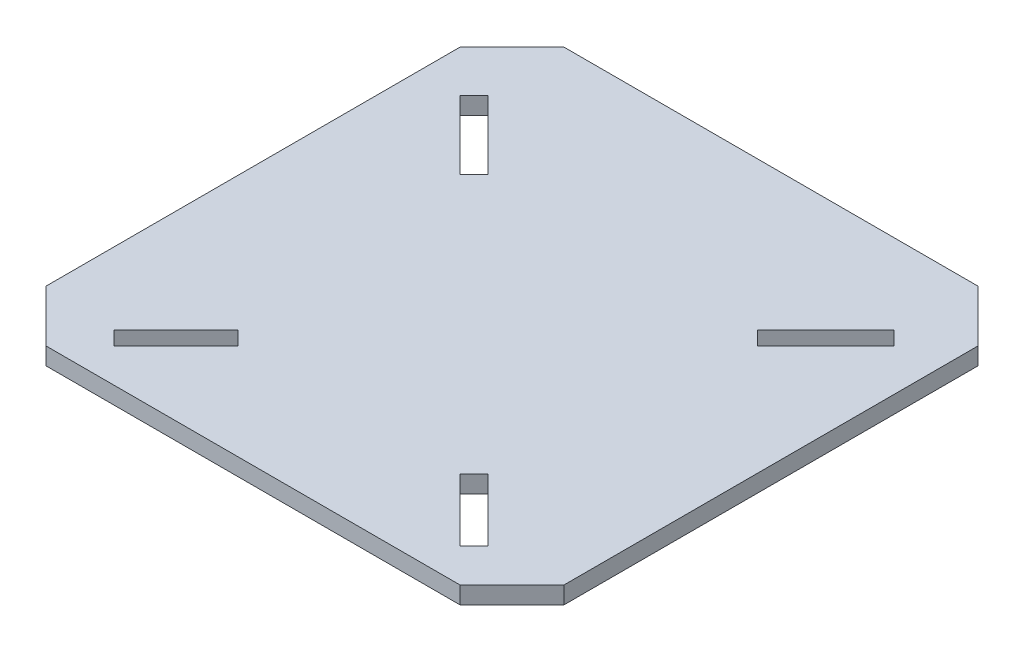
ISO-10303-21;
HEADER;
FILE_DESCRIPTION(('STEP AP214'),'2;1');
FILE_NAME('part.step','',(''),(''),'','','');
FILE_SCHEMA(('AUTOMOTIVE_DESIGN { 1 0 10303 214 1 1 1 1 }'));
ENDSEC;
DATA;
#1=APPLICATION_CONTEXT('core data for automotive mechanical design processes');
#2=APPLICATION_PROTOCOL_DEFINITION('international standard','automotive_design',2000,#1);
#3=PRODUCT_CONTEXT('',#1,'mechanical');
#4=PRODUCT('Part','Part','',(#3));
#5=PRODUCT_RELATED_PRODUCT_CATEGORY('part','',(#4));
#6=PRODUCT_DEFINITION_FORMATION('','',#4);
#7=PRODUCT_DEFINITION_CONTEXT('part definition',#1,'design');
#8=PRODUCT_DEFINITION('design','',#6,#7);
#9=PRODUCT_DEFINITION_SHAPE('','',#8);
#10=(LENGTH_UNIT() NAMED_UNIT(*) SI_UNIT(.MILLI.,.METRE.));
#11=(NAMED_UNIT(*) PLANE_ANGLE_UNIT() SI_UNIT($,.RADIAN.));
#12=(NAMED_UNIT(*) SI_UNIT($,.STERADIAN.) SOLID_ANGLE_UNIT());
#13=UNCERTAINTY_MEASURE_WITH_UNIT(LENGTH_MEASURE(1.E-05),#10,'distance_accuracy_value','');
#14=(GEOMETRIC_REPRESENTATION_CONTEXT(3) GLOBAL_UNCERTAINTY_ASSIGNED_CONTEXT((#13)) GLOBAL_UNIT_ASSIGNED_CONTEXT((#10,
#11,#12)) REPRESENTATION_CONTEXT('',''));
#15=CARTESIAN_POINT('',(0.,0.,0.));
#16=DIRECTION('',(0.,0.,1.));
#17=DIRECTION('',(1.,0.,0.));
#18=AXIS2_PLACEMENT_3D('',#15,#16,#17);
#19=CARTESIAN_POINT('',(0.,1.,0.));
#20=DIRECTION('',(0.,-1.,0.));
#21=DIRECTION('',(0.,0.,-1.));
#22=AXIS2_PLACEMENT_3D('',#19,#20,#21);
#23=PLANE('',#22);
#24=DIRECTION('',(-0.707106781186548,0.,0.707106781186547));
#25=VECTOR('',#24,1.);
#26=CARTESIAN_POINT('',(-22.2369460468129,1.,-6.36977275165112));
#27=LINE('',#26,#25);
#28=CARTESIAN_POINT('',(-22.2369460468129,1.,-6.36977275165112));
#29=VERTEX_POINT('',#28);
#30=CARTESIAN_POINT('',(-25.8351285672844,1.,-2.77159023117964));
#31=VERTEX_POINT('',#30);
#32=EDGE_CURVE('E283',#29,#31,#27,.T.);
#33=ORIENTED_EDGE('',*,*,#32,.F.);
#34=DIRECTION('',(-0.707106781186549,0.,-0.707106781186546));
#35=VECTOR('',#34,1.);
#36=CARTESIAN_POINT('',(-21.4335866475809,1.,-5.56641335241909));
#37=LINE('',#36,#35);
#38=CARTESIAN_POINT('',(-21.4335866475809,1.,-5.56641335241909));
#39=VERTEX_POINT('',#38);
#40=EDGE_CURVE('E278',#39,#29,#37,.T.);
#41=ORIENTED_EDGE('',*,*,#40,.F.);
#42=DIRECTION('',(0.707106781186547,0.,-0.707106781186548));
#43=VECTOR('',#42,1.);
#44=CARTESIAN_POINT('',(-25.0317691680524,1.,-1.96823083194761));
#45=LINE('',#44,#43);
#46=CARTESIAN_POINT('',(-25.0317691680524,1.,-1.96823083194761));
#47=VERTEX_POINT('',#46);
#48=EDGE_CURVE('E292',#47,#39,#45,.T.);
#49=ORIENTED_EDGE('',*,*,#48,.F.);
#50=DIRECTION('',(0.707106781186546,0.,0.707106781186549));
#51=VECTOR('',#50,1.);
#52=CARTESIAN_POINT('',(-25.8351285672844,1.,-2.77159023117964));
#53=LINE('',#52,#51);
#54=EDGE_CURVE('E294',#31,#47,#53,.T.);
#55=ORIENTED_EDGE('',*,*,#54,.F.);
#56=EDGE_LOOP('',(#33,#41,#49,#55));
#57=FACE_BOUND('',#56,.T.);
#58=DIRECTION('',(-0.707106781186548,0.,-0.707106781186548));
#59=VECTOR('',#58,1.);
#60=CARTESIAN_POINT('',(-22.8050801289926,1.,-21.4117989274567));
#61=LINE('',#60,#59);
#62=CARTESIAN_POINT('',(-22.8050801289926,1.,-21.4117989274567));
#63=VERTEX_POINT('',#62);
#64=CARTESIAN_POINT('',(-26.7684917022939,1.,-25.375210500758));
#65=VERTEX_POINT('',#64);
#66=EDGE_CURVE('E297',#63,#65,#61,.T.);
#67=ORIENTED_EDGE('',*,*,#66,.F.);
#68=DIRECTION('',(0.707106781186548,0.,-0.707106781186548));
#69=VECTOR('',#68,1.);
#70=CARTESIAN_POINT('',(-23.6084395282247,1.,-20.6084395282247));
#71=LINE('',#70,#69);
#72=CARTESIAN_POINT('',(-23.6084395282247,1.,-20.6084395282247));
#73=VERTEX_POINT('',#72);
#74=EDGE_CURVE('E305',#73,#63,#71,.T.);
#75=ORIENTED_EDGE('',*,*,#74,.F.);
#76=DIRECTION('',(0.707106781186548,0.,0.707106781186548));
#77=VECTOR('',#76,1.);
#78=CARTESIAN_POINT('',(-27.571851101526,1.,-24.571851101526));
#79=LINE('',#78,#77);
#80=CARTESIAN_POINT('',(-27.571851101526,1.,-24.571851101526));
#81=VERTEX_POINT('',#80);
#82=EDGE_CURVE('E302',#81,#73,#79,.T.);
#83=ORIENTED_EDGE('',*,*,#82,.F.);
#84=DIRECTION('',(-0.707106781186548,0.,0.707106781186548));
#85=VECTOR('',#84,1.);
#86=CARTESIAN_POINT('',(-26.7684917022939,1.,-25.375210500758));
#87=LINE('',#86,#85);
#88=EDGE_CURVE('E299',#65,#81,#87,.T.);
#89=ORIENTED_EDGE('',*,*,#88,.F.);
#90=EDGE_LOOP('',(#67,#75,#83,#89));
#91=FACE_BOUND('',#90,.T.);
#92=DIRECTION('',(-1.,0.,0.));
#93=VECTOR('',#92,1.);
#94=CARTESIAN_POINT('',(-3.,1.,-30.));
#95=LINE('',#94,#93);
#96=CARTESIAN_POINT('',(-3.,1.,-30.));
#97=VERTEX_POINT('',#96);
#98=CARTESIAN_POINT('',(-27.,1.,-30.));
#99=VERTEX_POINT('',#98);
#100=EDGE_CURVE('E328',#97,#99,#95,.T.);
#101=ORIENTED_EDGE('',*,*,#100,.T.);
#102=DIRECTION('',(-0.707106781186548,0.,0.707106781186548));
#103=VECTOR('',#102,1.);
#104=CARTESIAN_POINT('',(-27.,1.,-30.));
#105=LINE('',#104,#103);
#106=CARTESIAN_POINT('',(-30.,1.,-27.));
#107=VERTEX_POINT('',#106);
#108=EDGE_CURVE('E331',#99,#107,#105,.T.);
#109=ORIENTED_EDGE('',*,*,#108,.T.);
#110=DIRECTION('',(0.,0.,1.));
#111=VECTOR('',#110,1.);
#112=CARTESIAN_POINT('',(-30.,1.,-3.));
#113=LINE('',#112,#111);
#114=CARTESIAN_POINT('',(-30.,1.,-3.));
#115=VERTEX_POINT('',#114);
#116=EDGE_CURVE('E334',#107,#115,#113,.T.);
#117=ORIENTED_EDGE('',*,*,#116,.T.);
#118=DIRECTION('',(0.707106781186547,0.,0.707106781186548));
#119=VECTOR('',#118,1.);
#120=CARTESIAN_POINT('',(-27.,1.,0.));
#121=LINE('',#120,#119);
#122=CARTESIAN_POINT('',(-27.,1.,0.));
#123=VERTEX_POINT('',#122);
#124=EDGE_CURVE('E336',#115,#123,#121,.T.);
#125=ORIENTED_EDGE('',*,*,#124,.T.);
#126=DIRECTION('',(1.,0.,0.));
#127=VECTOR('',#126,1.);
#128=CARTESIAN_POINT('',(-3.,1.,0.));
#129=LINE('',#128,#127);
#130=CARTESIAN_POINT('',(-3.,1.,0.));
#131=VERTEX_POINT('',#130);
#132=EDGE_CURVE('E338',#123,#131,#129,.T.);
#133=ORIENTED_EDGE('',*,*,#132,.T.);
#134=DIRECTION('',(0.707106781186547,0.,-0.707106781186548));
#135=VECTOR('',#134,1.);
#136=CARTESIAN_POINT('',(-3.,1.,0.));
#137=LINE('',#136,#135);
#138=CARTESIAN_POINT('',(0.,1.,-3.));
#139=VERTEX_POINT('',#138);
#140=EDGE_CURVE('E340',#131,#139,#137,.T.);
#141=ORIENTED_EDGE('',*,*,#140,.T.);
#142=DIRECTION('',(0.,0.,-1.));
#143=VECTOR('',#142,1.);
#144=CARTESIAN_POINT('',(0.,1.,-3.));
#145=LINE('',#144,#143);
#146=CARTESIAN_POINT('',(0.,1.,-27.));
#147=VERTEX_POINT('',#146);
#148=EDGE_CURVE('E342',#139,#147,#145,.T.);
#149=ORIENTED_EDGE('',*,*,#148,.T.);
#150=DIRECTION('',(-0.707106781186548,0.,-0.707106781186547));
#151=VECTOR('',#150,1.);
#152=CARTESIAN_POINT('',(0.,1.,-27.));
#153=LINE('',#152,#151);
#154=EDGE_CURVE('E344',#147,#97,#153,.T.);
#155=ORIENTED_EDGE('',*,*,#154,.T.);
#156=EDGE_LOOP('',(#101,#109,#117,#125,#133,#141,#149,#155));
#157=FACE_BOUND('',#156,.T.);
#158=DIRECTION('',(-0.707106781186548,0.,0.707106781186547));
#159=VECTOR('',#158,1.);
#160=CARTESIAN_POINT('',(-7.76321581687159,1.,-6.36993461533564));
#161=LINE('',#160,#159);
#162=CARTESIAN_POINT('',(-7.76321581687159,1.,-6.36993461533564));
#163=VERTEX_POINT('',#162);
#164=CARTESIAN_POINT('',(-8.56657521610362,1.,-5.56657521610362));
#165=VERTEX_POINT('',#164);
#166=EDGE_CURVE('E221',#163,#165,#161,.T.);
#167=ORIENTED_EDGE('',*,*,#166,.F.);
#168=DIRECTION('',(-0.707106781186547,0.,-0.707106781186547));
#169=VECTOR('',#168,1.);
#170=CARTESIAN_POINT('',(-4.16487143271558,1.,-2.77159023117964));
#171=LINE('',#170,#169);
#172=CARTESIAN_POINT('',(-4.16487143271558,1.,-2.77159023117964));
#173=VERTEX_POINT('',#172);
#174=EDGE_CURVE('E233',#173,#163,#171,.T.);
#175=ORIENTED_EDGE('',*,*,#174,.F.);
#176=DIRECTION('',(0.707106781186548,0.,-0.707106781186547));
#177=VECTOR('',#176,1.);
#178=CARTESIAN_POINT('',(-4.96823083194761,1.,-1.96823083194761));
#179=LINE('',#178,#177);
#180=CARTESIAN_POINT('',(-4.96823083194761,1.,-1.96823083194761));
#181=VERTEX_POINT('',#180);
#182=EDGE_CURVE('E208',#181,#173,#179,.T.);
#183=ORIENTED_EDGE('',*,*,#182,.F.);
#184=DIRECTION('',(0.707106781186548,0.,0.707106781186548));
#185=VECTOR('',#184,1.);
#186=CARTESIAN_POINT('',(-4.96823083194761,1.,-1.96823083194761));
#187=LINE('',#186,#185);
#188=EDGE_CURVE('E236',#165,#181,#187,.T.);
#189=ORIENTED_EDGE('',*,*,#188,.F.);
#190=EDGE_LOOP('',(#167,#175,#183,#189));
#191=FACE_BOUND('',#190,.T.);
#192=DIRECTION('',(-0.707106781186548,0.,0.707106781186547));
#193=VECTOR('',#192,1.);
#194=CARTESIAN_POINT('',(-7.19491987100735,1.,-21.4117989274567));
#195=LINE('',#194,#193);
#196=CARTESIAN_POINT('',(-3.23150829770606,1.,-25.375210500758));
#197=VERTEX_POINT('',#196);
#198=CARTESIAN_POINT('',(-7.19491987100735,1.,-21.4117989274567));
#199=VERTEX_POINT('',#198);
#200=EDGE_CURVE('E254',#197,#199,#195,.T.);
#201=ORIENTED_EDGE('',*,*,#200,.F.);
#202=DIRECTION('',(-0.707106781186548,0.,-0.707106781186547));
#203=VECTOR('',#202,1.);
#204=CARTESIAN_POINT('',(-3.23150829770606,1.,-25.375210500758));
#205=LINE('',#204,#203);
#206=CARTESIAN_POINT('',(-2.42814889847403,1.,-24.571851101526));
#207=VERTEX_POINT('',#206);
#208=EDGE_CURVE('E249',#207,#197,#205,.T.);
#209=ORIENTED_EDGE('',*,*,#208,.F.);
#210=DIRECTION('',(0.707106781186548,0.,-0.707106781186547));
#211=VECTOR('',#210,1.);
#212=CARTESIAN_POINT('',(-2.42814889847403,1.,-24.571851101526));
#213=LINE('',#212,#211);
#214=CARTESIAN_POINT('',(-6.39156047177533,1.,-20.6084395282247));
#215=VERTEX_POINT('',#214);
#216=EDGE_CURVE('E265',#215,#207,#213,.T.);
#217=ORIENTED_EDGE('',*,*,#216,.F.);
#218=DIRECTION('',(0.707106781186548,0.,0.707106781186548));
#219=VECTOR('',#218,1.);
#220=CARTESIAN_POINT('',(-6.39156047177533,1.,-20.6084395282247));
#221=LINE('',#220,#219);
#222=EDGE_CURVE('E267',#199,#215,#221,.T.);
#223=ORIENTED_EDGE('',*,*,#222,.F.);
#224=EDGE_LOOP('',(#201,#209,#217,#223));
#225=FACE_BOUND('',#224,.T.);
#226=ADVANCED_FACE('F39',(#57,#91,#157,#191,#225),#23,.F.);
#227=CARTESIAN_POINT('',(0.,0.,0.));
#228=DIRECTION('',(0.,-1.,0.));
#229=DIRECTION('',(0.,0.,-1.));
#230=AXIS2_PLACEMENT_3D('',#227,#228,#229);
#231=PLANE('',#230);
#232=DIRECTION('',(-1.,0.,0.));
#233=VECTOR('',#232,1.);
#234=CARTESIAN_POINT('',(-3.,0.,-30.));
#235=LINE('',#234,#233);
#236=CARTESIAN_POINT('',(-3.,0.,-30.));
#237=VERTEX_POINT('',#236);
#238=CARTESIAN_POINT('',(-27.,0.,-30.));
#239=VERTEX_POINT('',#238);
#240=EDGE_CURVE('E327',#237,#239,#235,.T.);
#241=ORIENTED_EDGE('',*,*,#240,.F.);
#242=DIRECTION('',(-0.707106781186548,0.,-0.707106781186547));
#243=VECTOR('',#242,1.);
#244=CARTESIAN_POINT('',(0.,0.,-27.));
#245=LINE('',#244,#243);
#246=CARTESIAN_POINT('',(0.,0.,-27.));
#247=VERTEX_POINT('',#246);
#248=EDGE_CURVE('E332',#247,#237,#245,.T.);
#249=ORIENTED_EDGE('',*,*,#248,.F.);
#250=DIRECTION('',(0.,0.,-1.));
#251=VECTOR('',#250,1.);
#252=CARTESIAN_POINT('',(0.,0.,-3.));
#253=LINE('',#252,#251);
#254=CARTESIAN_POINT('',(0.,0.,-3.));
#255=VERTEX_POINT('',#254);
#256=EDGE_CURVE('E359',#255,#247,#253,.T.);
#257=ORIENTED_EDGE('',*,*,#256,.F.);
#258=DIRECTION('',(0.707106781186547,0.,-0.707106781186548));
#259=VECTOR('',#258,1.);
#260=CARTESIAN_POINT('',(-3.,0.,0.));
#261=LINE('',#260,#259);
#262=CARTESIAN_POINT('',(-3.,0.,0.));
#263=VERTEX_POINT('',#262);
#264=EDGE_CURVE('E357',#263,#255,#261,.T.);
#265=ORIENTED_EDGE('',*,*,#264,.F.);
#266=DIRECTION('',(1.,0.,0.));
#267=VECTOR('',#266,1.);
#268=CARTESIAN_POINT('',(-3.,0.,0.));
#269=LINE('',#268,#267);
#270=CARTESIAN_POINT('',(-27.,0.,0.));
#271=VERTEX_POINT('',#270);
#272=EDGE_CURVE('E355',#271,#263,#269,.T.);
#273=ORIENTED_EDGE('',*,*,#272,.F.);
#274=DIRECTION('',(0.707106781186547,0.,0.707106781186548));
#275=VECTOR('',#274,1.);
#276=CARTESIAN_POINT('',(-27.,0.,0.));
#277=LINE('',#276,#275);
#278=CARTESIAN_POINT('',(-30.,0.,-3.));
#279=VERTEX_POINT('',#278);
#280=EDGE_CURVE('E353',#279,#271,#277,.T.);
#281=ORIENTED_EDGE('',*,*,#280,.F.);
#282=DIRECTION('',(0.,0.,1.));
#283=VECTOR('',#282,1.);
#284=CARTESIAN_POINT('',(-30.,0.,-3.));
#285=LINE('',#284,#283);
#286=CARTESIAN_POINT('',(-30.,0.,-27.));
#287=VERTEX_POINT('',#286);
#288=EDGE_CURVE('E351',#287,#279,#285,.T.);
#289=ORIENTED_EDGE('',*,*,#288,.F.);
#290=DIRECTION('',(-0.707106781186548,0.,0.707106781186548));
#291=VECTOR('',#290,1.);
#292=CARTESIAN_POINT('',(-27.,0.,-30.));
#293=LINE('',#292,#291);
#294=EDGE_CURVE('E349',#239,#287,#293,.T.);
#295=ORIENTED_EDGE('',*,*,#294,.F.);
#296=EDGE_LOOP('',(#241,#249,#257,#265,#273,#281,#289,#295));
#297=FACE_BOUND('',#296,.T.);
#298=DIRECTION('',(0.707106781186548,0.,-0.707106781186548));
#299=VECTOR('',#298,1.);
#300=CARTESIAN_POINT('',(-23.6084395282247,0.,-20.6084395282247));
#301=LINE('',#300,#299);
#302=CARTESIAN_POINT('',(-23.6084395282247,0.,-20.6084395282247));
#303=VERTEX_POINT('',#302);
#304=CARTESIAN_POINT('',(-22.8050801289926,0.,-21.4117989274567));
#305=VERTEX_POINT('',#304);
#306=EDGE_CURVE('E300',#303,#305,#301,.T.);
#307=ORIENTED_EDGE('',*,*,#306,.T.);
#308=DIRECTION('',(-0.707106781186548,0.,-0.707106781186548));
#309=VECTOR('',#308,1.);
#310=CARTESIAN_POINT('',(-22.8050801289926,0.,-21.4117989274567));
#311=LINE('',#310,#309);
#312=CARTESIAN_POINT('',(-26.7684917022939,0.,-25.375210500758));
#313=VERTEX_POINT('',#312);
#314=EDGE_CURVE('E263',#305,#313,#311,.T.);
#315=ORIENTED_EDGE('',*,*,#314,.T.);
#316=DIRECTION('',(-0.707106781186548,0.,0.707106781186548));
#317=VECTOR('',#316,1.);
#318=CARTESIAN_POINT('',(-26.7684917022939,0.,-25.375210500758));
#319=LINE('',#318,#317);
#320=CARTESIAN_POINT('',(-27.571851101526,0.,-24.571851101526));
#321=VERTEX_POINT('',#320);
#322=EDGE_CURVE('E310',#313,#321,#319,.T.);
#323=ORIENTED_EDGE('',*,*,#322,.T.);
#324=DIRECTION('',(0.707106781186548,0.,0.707106781186548));
#325=VECTOR('',#324,1.);
#326=CARTESIAN_POINT('',(-27.571851101526,0.,-24.571851101526));
#327=LINE('',#326,#325);
#328=EDGE_CURVE('E313',#321,#303,#327,.T.);
#329=ORIENTED_EDGE('',*,*,#328,.T.);
#330=EDGE_LOOP('',(#307,#315,#323,#329));
#331=FACE_BOUND('',#330,.T.);
#332=DIRECTION('',(-0.707106781186547,0.,-0.707106781186547));
#333=VECTOR('',#332,1.);
#334=CARTESIAN_POINT('',(-4.16487143271558,0.,-2.77159023117964));
#335=LINE('',#334,#333);
#336=CARTESIAN_POINT('',(-4.16487143271558,0.,-2.77159023117964));
#337=VERTEX_POINT('',#336);
#338=CARTESIAN_POINT('',(-7.76321581687159,0.,-6.36993461533564));
#339=VERTEX_POINT('',#338);
#340=EDGE_CURVE('E216',#337,#339,#335,.T.);
#341=ORIENTED_EDGE('',*,*,#340,.T.);
#342=DIRECTION('',(-0.707106781186548,0.,0.707106781186547));
#343=VECTOR('',#342,1.);
#344=CARTESIAN_POINT('',(-7.76321581687159,0.,-6.36993461533564));
#345=LINE('',#344,#343);
#346=CARTESIAN_POINT('',(-8.56657521610362,0.,-5.56657521610362));
#347=VERTEX_POINT('',#346);
#348=EDGE_CURVE('E227',#339,#347,#345,.T.);
#349=ORIENTED_EDGE('',*,*,#348,.T.);
#350=DIRECTION('',(0.707106781186548,0.,0.707106781186548));
#351=VECTOR('',#350,1.);
#352=CARTESIAN_POINT('',(-4.96823083194761,0.,-1.96823083194761));
#353=LINE('',#352,#351);
#354=CARTESIAN_POINT('',(-4.96823083194761,0.,-1.96823083194761));
#355=VERTEX_POINT('',#354);
#356=EDGE_CURVE('E225',#347,#355,#353,.T.);
#357=ORIENTED_EDGE('',*,*,#356,.T.);
#358=DIRECTION('',(0.707106781186548,0.,-0.707106781186547));
#359=VECTOR('',#358,1.);
#360=CARTESIAN_POINT('',(-4.96823083194761,0.,-1.96823083194761));
#361=LINE('',#360,#359);
#362=EDGE_CURVE('E205',#355,#337,#361,.T.);
#363=ORIENTED_EDGE('',*,*,#362,.T.);
#364=EDGE_LOOP('',(#341,#349,#357,#363));
#365=FACE_BOUND('',#364,.T.);
#366=DIRECTION('',(-0.707106781186549,0.,-0.707106781186546));
#367=VECTOR('',#366,1.);
#368=CARTESIAN_POINT('',(-21.4335866475809,0.,-5.56641335241909));
#369=LINE('',#368,#367);
#370=CARTESIAN_POINT('',(-21.4335866475809,0.,-5.56641335241909));
#371=VERTEX_POINT('',#370);
#372=CARTESIAN_POINT('',(-22.2369460468129,0.,-6.36977275165111));
#373=VERTEX_POINT('',#372);
#374=EDGE_CURVE('E279',#371,#373,#369,.T.);
#375=ORIENTED_EDGE('',*,*,#374,.T.);
#376=DIRECTION('',(-0.707106781186548,0.,0.707106781186547));
#377=VECTOR('',#376,1.);
#378=CARTESIAN_POINT('',(-22.2369460468129,0.,-6.36977275165112));
#379=LINE('',#378,#377);
#380=CARTESIAN_POINT('',(-25.8351285672844,0.,-2.77159023117964));
#381=VERTEX_POINT('',#380);
#382=EDGE_CURVE('E243',#373,#381,#379,.T.);
#383=ORIENTED_EDGE('',*,*,#382,.T.);
#384=DIRECTION('',(0.707106781186546,0.,0.707106781186549));
#385=VECTOR('',#384,1.);
#386=CARTESIAN_POINT('',(-25.8351285672844,0.,-2.77159023117964));
#387=LINE('',#386,#385);
#388=CARTESIAN_POINT('',(-25.0317691680524,0.,-1.96823083194761));
#389=VERTEX_POINT('',#388);
#390=EDGE_CURVE('E286',#381,#389,#387,.T.);
#391=ORIENTED_EDGE('',*,*,#390,.T.);
#392=DIRECTION('',(0.707106781186547,0.,-0.707106781186548));
#393=VECTOR('',#392,1.);
#394=CARTESIAN_POINT('',(-25.0317691680524,0.,-1.96823083194761));
#395=LINE('',#394,#393);
#396=EDGE_CURVE('E282',#389,#371,#395,.T.);
#397=ORIENTED_EDGE('',*,*,#396,.T.);
#398=EDGE_LOOP('',(#375,#383,#391,#397));
#399=FACE_BOUND('',#398,.T.);
#400=DIRECTION('',(-0.707106781186548,0.,-0.707106781186547));
#401=VECTOR('',#400,1.);
#402=CARTESIAN_POINT('',(-3.23150829770606,0.,-25.375210500758));
#403=LINE('',#402,#401);
#404=CARTESIAN_POINT('',(-2.42814889847403,0.,-24.571851101526));
#405=VERTEX_POINT('',#404);
#406=CARTESIAN_POINT('',(-3.23150829770606,0.,-25.375210500758));
#407=VERTEX_POINT('',#406);
#408=EDGE_CURVE('E250',#405,#407,#403,.T.);
#409=ORIENTED_EDGE('',*,*,#408,.T.);
#410=DIRECTION('',(-0.707106781186548,0.,0.707106781186547));
#411=VECTOR('',#410,1.);
#412=CARTESIAN_POINT('',(-7.19491987100735,0.,-21.4117989274567));
#413=LINE('',#412,#411);
#414=CARTESIAN_POINT('',(-7.19491987100735,0.,-21.4117989274567));
#415=VERTEX_POINT('',#414);
#416=EDGE_CURVE('E260',#407,#415,#413,.T.);
#417=ORIENTED_EDGE('',*,*,#416,.T.);
#418=DIRECTION('',(0.707106781186548,0.,0.707106781186548));
#419=VECTOR('',#418,1.);
#420=CARTESIAN_POINT('',(-6.39156047177533,0.,-20.6084395282247));
#421=LINE('',#420,#419);
#422=CARTESIAN_POINT('',(-6.39156047177533,0.,-20.6084395282247));
#423=VERTEX_POINT('',#422);
#424=EDGE_CURVE('E257',#415,#423,#421,.T.);
#425=ORIENTED_EDGE('',*,*,#424,.T.);
#426=DIRECTION('',(0.707106781186548,0.,-0.707106781186547));
#427=VECTOR('',#426,1.);
#428=CARTESIAN_POINT('',(-2.42814889847403,0.,-24.571851101526));
#429=LINE('',#428,#427);
#430=EDGE_CURVE('E253',#423,#405,#429,.T.);
#431=ORIENTED_EDGE('',*,*,#430,.T.);
#432=EDGE_LOOP('',(#409,#417,#425,#431));
#433=FACE_BOUND('',#432,.T.);
#434=ADVANCED_FACE('F223',(#297,#331,#365,#399,#433),#231,.T.);
#435=CARTESIAN_POINT('',(-3.,1.,-30.));
#436=DIRECTION('',(0.,0.,1.));
#437=DIRECTION('',(1.,0.,0.));
#438=AXIS2_PLACEMENT_3D('',#435,#436,#437);
#439=PLANE('',#438);
#440=ORIENTED_EDGE('',*,*,#240,.T.);
#441=DIRECTION('',(0.,-1.,0.));
#442=VECTOR('',#441,1.);
#443=CARTESIAN_POINT('',(-27.,1.,-30.));
#444=LINE('',#443,#442);
#445=EDGE_CURVE('E11',#99,#239,#444,.T.);
#446=ORIENTED_EDGE('',*,*,#445,.F.);
#447=ORIENTED_EDGE('',*,*,#100,.F.);
#448=DIRECTION('',(0.,-1.,0.));
#449=VECTOR('',#448,1.);
#450=CARTESIAN_POINT('',(-3.,1.,-30.));
#451=LINE('',#450,#449);
#452=EDGE_CURVE('E346',#97,#237,#451,.T.);
#453=ORIENTED_EDGE('',*,*,#452,.T.);
#454=EDGE_LOOP('',(#440,#446,#447,#453));
#455=FACE_BOUND('',#454,.T.);
#456=ADVANCED_FACE('F41',(#455),#439,.F.);
#457=CARTESIAN_POINT('',(-27.,1.,-30.));
#458=DIRECTION('',(0.707106781186547,0.,0.707106781186547));
#459=DIRECTION('',(0.707106781186548,0.,-0.707106781186548));
#460=AXIS2_PLACEMENT_3D('',#457,#458,#459);
#461=PLANE('',#460);
#462=ORIENTED_EDGE('',*,*,#294,.T.);
#463=DIRECTION('',(0.,-1.,0.));
#464=VECTOR('',#463,1.);
#465=CARTESIAN_POINT('',(-30.,1.,-27.));
#466=LINE('',#465,#464);
#467=EDGE_CURVE('E47',#107,#287,#466,.T.);
#468=ORIENTED_EDGE('',*,*,#467,.F.);
#469=ORIENTED_EDGE('',*,*,#108,.F.);
#470=ORIENTED_EDGE('',*,*,#445,.T.);
#471=EDGE_LOOP('',(#462,#468,#469,#470));
#472=FACE_BOUND('',#471,.T.);
#473=ADVANCED_FACE('F406',(#472),#461,.F.);
#474=CARTESIAN_POINT('',(-30.,1.,-3.));
#475=DIRECTION('',(1.,0.,0.));
#476=DIRECTION('',(0.,0.,-1.));
#477=AXIS2_PLACEMENT_3D('',#474,#475,#476);
#478=PLANE('',#477);
#479=ORIENTED_EDGE('',*,*,#288,.T.);
#480=DIRECTION('',(0.,-1.,0.));
#481=VECTOR('',#480,1.);
#482=CARTESIAN_POINT('',(-30.,1.,-3.));
#483=LINE('',#482,#481);
#484=EDGE_CURVE('E376',#115,#279,#483,.T.);
#485=ORIENTED_EDGE('',*,*,#484,.F.);
#486=ORIENTED_EDGE('',*,*,#116,.F.);
#487=ORIENTED_EDGE('',*,*,#467,.T.);
#488=EDGE_LOOP('',(#479,#485,#486,#487));
#489=FACE_BOUND('',#488,.T.);
#490=ADVANCED_FACE('F383',(#489),#478,.F.);
#491=CARTESIAN_POINT('',(-27.,1.,0.));
#492=DIRECTION('',(0.707106781186548,0.,-0.707106781186547));
#493=DIRECTION('',(-0.707106781186547,0.,-0.707106781186548));
#494=AXIS2_PLACEMENT_3D('',#491,#492,#493);
#495=PLANE('',#494);
#496=ORIENTED_EDGE('',*,*,#280,.T.);
#497=DIRECTION('',(0.,-1.,0.));
#498=VECTOR('',#497,1.);
#499=CARTESIAN_POINT('',(-27.,1.,0.));
#500=LINE('',#499,#498);
#501=EDGE_CURVE('E373',#123,#271,#500,.T.);
#502=ORIENTED_EDGE('',*,*,#501,.F.);
#503=ORIENTED_EDGE('',*,*,#124,.F.);
#504=ORIENTED_EDGE('',*,*,#484,.T.);
#505=EDGE_LOOP('',(#496,#502,#503,#504));
#506=FACE_BOUND('',#505,.T.);
#507=ADVANCED_FACE('F394',(#506),#495,.F.);
#508=CARTESIAN_POINT('',(-3.,1.,0.));
#509=DIRECTION('',(0.,0.,-1.));
#510=DIRECTION('',(-1.,0.,0.));
#511=AXIS2_PLACEMENT_3D('',#508,#509,#510);
#512=PLANE('',#511);
#513=ORIENTED_EDGE('',*,*,#272,.T.);
#514=DIRECTION('',(0.,-1.,0.));
#515=VECTOR('',#514,1.);
#516=CARTESIAN_POINT('',(-3.,1.,0.));
#517=LINE('',#516,#515);
#518=EDGE_CURVE('E370',#131,#263,#517,.T.);
#519=ORIENTED_EDGE('',*,*,#518,.F.);
#520=ORIENTED_EDGE('',*,*,#132,.F.);
#521=ORIENTED_EDGE('',*,*,#501,.T.);
#522=EDGE_LOOP('',(#513,#519,#520,#521));
#523=FACE_BOUND('',#522,.T.);
#524=ADVANCED_FACE('F398',(#523),#512,.F.);
#525=CARTESIAN_POINT('',(-3.,1.,0.));
#526=DIRECTION('',(-0.707106781186548,0.,-0.707106781186547));
#527=DIRECTION('',(-0.707106781186547,0.,0.707106781186548));
#528=AXIS2_PLACEMENT_3D('',#525,#526,#527);
#529=PLANE('',#528);
#530=ORIENTED_EDGE('',*,*,#264,.T.);
#531=DIRECTION('',(0.,-1.,0.));
#532=VECTOR('',#531,1.);
#533=CARTESIAN_POINT('',(0.,1.,-3.));
#534=LINE('',#533,#532);
#535=EDGE_CURVE('E367',#139,#255,#534,.T.);
#536=ORIENTED_EDGE('',*,*,#535,.F.);
#537=ORIENTED_EDGE('',*,*,#140,.F.);
#538=ORIENTED_EDGE('',*,*,#518,.T.);
#539=EDGE_LOOP('',(#530,#536,#537,#538));
#540=FACE_BOUND('',#539,.T.);
#541=ADVANCED_FACE('F419',(#540),#529,.F.);
#542=CARTESIAN_POINT('',(0.,1.,-3.));
#543=DIRECTION('',(-1.,0.,0.));
#544=DIRECTION('',(0.,0.,1.));
#545=AXIS2_PLACEMENT_3D('',#542,#543,#544);
#546=PLANE('',#545);
#547=ORIENTED_EDGE('',*,*,#256,.T.);
#548=DIRECTION('',(0.,-1.,0.));
#549=VECTOR('',#548,1.);
#550=CARTESIAN_POINT('',(0.,1.,-27.));
#551=LINE('',#550,#549);
#552=EDGE_CURVE('E364',#147,#247,#551,.T.);
#553=ORIENTED_EDGE('',*,*,#552,.F.);
#554=ORIENTED_EDGE('',*,*,#148,.F.);
#555=ORIENTED_EDGE('',*,*,#535,.T.);
#556=EDGE_LOOP('',(#547,#553,#554,#555));
#557=FACE_BOUND('',#556,.T.);
#558=ADVANCED_FACE('F417',(#557),#546,.F.);
#559=CARTESIAN_POINT('',(0.,1.,-27.));
#560=DIRECTION('',(-0.707106781186547,0.,0.707106781186548));
#561=DIRECTION('',(0.707106781186548,0.,0.707106781186547));
#562=AXIS2_PLACEMENT_3D('',#559,#560,#561);
#563=PLANE('',#562);
#564=ORIENTED_EDGE('',*,*,#248,.T.);
#565=ORIENTED_EDGE('',*,*,#452,.F.);
#566=ORIENTED_EDGE('',*,*,#154,.F.);
#567=ORIENTED_EDGE('',*,*,#552,.T.);
#568=EDGE_LOOP('',(#564,#565,#566,#567));
#569=FACE_BOUND('',#568,.T.);
#570=ADVANCED_FACE('F412',(#569),#563,.F.);
#571=CARTESIAN_POINT('',(-22.8050801289926,1.,-21.4117989274567));
#572=DIRECTION('',(-0.707106781186548,0.,0.707106781186548));
#573=DIRECTION('',(0.707106781186548,0.,0.707106781186548));
#574=AXIS2_PLACEMENT_3D('',#571,#572,#573);
#575=PLANE('',#574);
#576=ORIENTED_EDGE('',*,*,#314,.F.);
#577=DIRECTION('',(0.,-1.,0.));
#578=VECTOR('',#577,1.);
#579=CARTESIAN_POINT('',(-22.8050801289926,1.,-21.4117989274567));
#580=LINE('',#579,#578);
#581=EDGE_CURVE('E307',#63,#305,#580,.T.);
#582=ORIENTED_EDGE('',*,*,#581,.F.);
#583=ORIENTED_EDGE('',*,*,#66,.T.);
#584=DIRECTION('',(0.,-1.,0.));
#585=VECTOR('',#584,1.);
#586=CARTESIAN_POINT('',(-26.7684917022939,1.,-25.375210500758));
#587=LINE('',#586,#585);
#588=EDGE_CURVE('E324',#65,#313,#587,.T.);
#589=ORIENTED_EDGE('',*,*,#588,.T.);
#590=EDGE_LOOP('',(#576,#582,#583,#589));
#591=FACE_BOUND('',#590,.T.);
#592=ADVANCED_FACE('F438',(#591),#575,.T.);
#593=CARTESIAN_POINT('',(-26.7684917022939,1.,-25.375210500758));
#594=DIRECTION('',(0.707106781186547,0.,0.707106781186547));
#595=DIRECTION('',(0.707106781186548,0.,-0.707106781186548));
#596=AXIS2_PLACEMENT_3D('',#593,#594,#595);
#597=PLANE('',#596);
#598=ORIENTED_EDGE('',*,*,#322,.F.);
#599=ORIENTED_EDGE('',*,*,#588,.F.);
#600=ORIENTED_EDGE('',*,*,#88,.T.);
#601=DIRECTION('',(0.,-1.,0.));
#602=VECTOR('',#601,1.);
#603=CARTESIAN_POINT('',(-27.571851101526,1.,-24.571851101526));
#604=LINE('',#603,#602);
#605=EDGE_CURVE('E322',#81,#321,#604,.T.);
#606=ORIENTED_EDGE('',*,*,#605,.T.);
#607=EDGE_LOOP('',(#598,#599,#600,#606));
#608=FACE_BOUND('',#607,.T.);
#609=ADVANCED_FACE('F445',(#608),#597,.T.);
#610=CARTESIAN_POINT('',(-27.571851101526,1.,-24.571851101526));
#611=DIRECTION('',(0.707106781186548,0.,-0.707106781186548));
#612=DIRECTION('',(-0.707106781186548,0.,-0.707106781186548));
#613=AXIS2_PLACEMENT_3D('',#610,#611,#612);
#614=PLANE('',#613);
#615=ORIENTED_EDGE('',*,*,#328,.F.);
#616=ORIENTED_EDGE('',*,*,#605,.F.);
#617=ORIENTED_EDGE('',*,*,#82,.T.);
#618=DIRECTION('',(0.,-1.,0.));
#619=VECTOR('',#618,1.);
#620=CARTESIAN_POINT('',(-23.6084395282247,1.,-20.6084395282247));
#621=LINE('',#620,#619);
#622=EDGE_CURVE('E320',#73,#303,#621,.T.);
#623=ORIENTED_EDGE('',*,*,#622,.T.);
#624=EDGE_LOOP('',(#615,#616,#617,#623));
#625=FACE_BOUND('',#624,.T.);
#626=ADVANCED_FACE('F450',(#625),#614,.T.);
#627=CARTESIAN_POINT('',(-23.6084395282247,1.,-20.6084395282247));
#628=DIRECTION('',(-0.707106781186547,0.,-0.707106781186547));
#629=DIRECTION('',(-0.707106781186548,0.,0.707106781186548));
#630=AXIS2_PLACEMENT_3D('',#627,#628,#629);
#631=PLANE('',#630);
#632=ORIENTED_EDGE('',*,*,#306,.F.);
#633=ORIENTED_EDGE('',*,*,#622,.F.);
#634=ORIENTED_EDGE('',*,*,#74,.T.);
#635=ORIENTED_EDGE('',*,*,#581,.T.);
#636=EDGE_LOOP('',(#632,#633,#634,#635));
#637=FACE_BOUND('',#636,.T.);
#638=ADVANCED_FACE('F457',(#637),#631,.T.);
#639=CARTESIAN_POINT('',(-7.76321581687159,1.,-6.36993461533564));
#640=DIRECTION('',(0.707106781186547,0.,0.707106781186548));
#641=DIRECTION('',(0.707106781186548,0.,-0.707106781186547));
#642=AXIS2_PLACEMENT_3D('',#639,#640,#641);
#643=PLANE('',#642);
#644=ORIENTED_EDGE('',*,*,#348,.F.);
#645=DIRECTION('',(0.,-1.,0.));
#646=VECTOR('',#645,1.);
#647=CARTESIAN_POINT('',(-7.76321581687159,1.,-6.36993461533564));
#648=LINE('',#647,#646);
#649=EDGE_CURVE('E211',#163,#339,#648,.T.);
#650=ORIENTED_EDGE('',*,*,#649,.F.);
#651=ORIENTED_EDGE('',*,*,#166,.T.);
#652=DIRECTION('',(0.,-1.,0.));
#653=VECTOR('',#652,1.);
#654=CARTESIAN_POINT('',(-8.56657521610362,1.,-5.56657521610362));
#655=LINE('',#654,#653);
#656=EDGE_CURVE('E517',#165,#347,#655,.T.);
#657=ORIENTED_EDGE('',*,*,#656,.T.);
#658=EDGE_LOOP('',(#644,#650,#651,#657));
#659=FACE_BOUND('',#658,.T.);
#660=ADVANCED_FACE('F469',(#659),#643,.T.);
#661=CARTESIAN_POINT('',(-4.96823083194761,1.,-1.96823083194761));
#662=DIRECTION('',(0.707106781186547,0.,-0.707106781186548));
#663=DIRECTION('',(-0.707106781186548,0.,-0.707106781186547));
#664=AXIS2_PLACEMENT_3D('',#661,#662,#663);
#665=PLANE('',#664);
#666=ORIENTED_EDGE('',*,*,#356,.F.);
#667=ORIENTED_EDGE('',*,*,#656,.F.);
#668=ORIENTED_EDGE('',*,*,#188,.T.);
#669=DIRECTION('',(0.,-1.,0.));
#670=VECTOR('',#669,1.);
#671=CARTESIAN_POINT('',(-4.96823083194761,1.,-1.96823083194761));
#672=LINE('',#671,#670);
#673=EDGE_CURVE('E212',#181,#355,#672,.T.);
#674=ORIENTED_EDGE('',*,*,#673,.T.);
#675=EDGE_LOOP('',(#666,#667,#668,#674));
#676=FACE_BOUND('',#675,.T.);
#677=ADVANCED_FACE('F506',(#676),#665,.T.);
#678=CARTESIAN_POINT('',(-4.96823083194761,1.,-1.96823083194761));
#679=DIRECTION('',(-0.707106781186547,0.,-0.707106781186548));
#680=DIRECTION('',(-0.707106781186548,0.,0.707106781186547));
#681=AXIS2_PLACEMENT_3D('',#678,#679,#680);
#682=PLANE('',#681);
#683=ORIENTED_EDGE('',*,*,#362,.F.);
#684=ORIENTED_EDGE('',*,*,#673,.F.);
#685=ORIENTED_EDGE('',*,*,#182,.T.);
#686=DIRECTION('',(0.,-1.,0.));
#687=VECTOR('',#686,1.);
#688=CARTESIAN_POINT('',(-4.16487143271558,1.,-2.77159023117964));
#689=LINE('',#688,#687);
#690=EDGE_CURVE('E200',#173,#337,#689,.T.);
#691=ORIENTED_EDGE('',*,*,#690,.T.);
#692=EDGE_LOOP('',(#683,#684,#685,#691));
#693=FACE_BOUND('',#692,.T.);
#694=ADVANCED_FACE('F202',(#693),#682,.T.);
#695=CARTESIAN_POINT('',(-4.16487143271558,1.,-2.77159023117964));
#696=DIRECTION('',(-0.707106781186547,0.,0.707106781186547));
#697=DIRECTION('',(0.707106781186548,0.,0.707106781186548));
#698=AXIS2_PLACEMENT_3D('',#695,#696,#697);
#699=PLANE('',#698);
#700=ORIENTED_EDGE('',*,*,#340,.F.);
#701=ORIENTED_EDGE('',*,*,#690,.F.);
#702=ORIENTED_EDGE('',*,*,#174,.T.);
#703=ORIENTED_EDGE('',*,*,#649,.T.);
#704=EDGE_LOOP('',(#700,#701,#702,#703));
#705=FACE_BOUND('',#704,.T.);
#706=ADVANCED_FACE('F217',(#705),#699,.T.);
#707=CARTESIAN_POINT('',(-22.2369460468129,1.,-6.36977275165112));
#708=DIRECTION('',(0.707106781186547,0.,0.707106781186548));
#709=DIRECTION('',(0.707106781186548,0.,-0.707106781186547));
#710=AXIS2_PLACEMENT_3D('',#707,#708,#709);
#711=PLANE('',#710);
#712=ORIENTED_EDGE('',*,*,#382,.F.);
#713=DIRECTION('',(0.,-1.,0.));
#714=VECTOR('',#713,1.);
#715=CARTESIAN_POINT('',(-22.2369460468129,1.,-6.36977275165112));
#716=LINE('',#715,#714);
#717=EDGE_CURVE('E275',#29,#373,#716,.T.);
#718=ORIENTED_EDGE('',*,*,#717,.F.);
#719=ORIENTED_EDGE('',*,*,#32,.T.);
#720=DIRECTION('',(0.,-1.,0.));
#721=VECTOR('',#720,1.);
#722=CARTESIAN_POINT('',(-25.8351285672844,1.,-2.77159023117964));
#723=LINE('',#722,#721);
#724=EDGE_CURVE('E232',#31,#381,#723,.T.);
#725=ORIENTED_EDGE('',*,*,#724,.T.);
#726=EDGE_LOOP('',(#712,#718,#719,#725));
#727=FACE_BOUND('',#726,.T.);
#728=ADVANCED_FACE('F483',(#727),#711,.T.);
#729=CARTESIAN_POINT('',(-25.8351285672844,1.,-2.77159023117964));
#730=DIRECTION('',(0.707106781186549,0.,-0.707106781186546));
#731=DIRECTION('',(-0.707106781186546,0.,-0.707106781186549));
#732=AXIS2_PLACEMENT_3D('',#729,#730,#731);
#733=PLANE('',#732);
#734=ORIENTED_EDGE('',*,*,#390,.F.);
#735=ORIENTED_EDGE('',*,*,#724,.F.);
#736=ORIENTED_EDGE('',*,*,#54,.T.);
#737=DIRECTION('',(0.,-1.,0.));
#738=VECTOR('',#737,1.);
#739=CARTESIAN_POINT('',(-25.0317691680524,1.,-1.96823083194761));
#740=LINE('',#739,#738);
#741=EDGE_CURVE('E272',#47,#389,#740,.T.);
#742=ORIENTED_EDGE('',*,*,#741,.T.);
#743=EDGE_LOOP('',(#734,#735,#736,#742));
#744=FACE_BOUND('',#743,.T.);
#745=ADVANCED_FACE('F479',(#744),#733,.T.);
#746=CARTESIAN_POINT('',(-25.0317691680524,1.,-1.96823083194761));
#747=DIRECTION('',(-0.707106781186548,0.,-0.707106781186547));
#748=DIRECTION('',(-0.707106781186547,0.,0.707106781186548));
#749=AXIS2_PLACEMENT_3D('',#746,#747,#748);
#750=PLANE('',#749);
#751=ORIENTED_EDGE('',*,*,#396,.F.);
#752=ORIENTED_EDGE('',*,*,#741,.F.);
#753=ORIENTED_EDGE('',*,*,#48,.T.);
#754=DIRECTION('',(0.,-1.,0.));
#755=VECTOR('',#754,1.);
#756=CARTESIAN_POINT('',(-21.4335866475809,1.,-5.56641335241909));
#757=LINE('',#756,#755);
#758=EDGE_CURVE('E62',#39,#371,#757,.T.);
#759=ORIENTED_EDGE('',*,*,#758,.T.);
#760=EDGE_LOOP('',(#751,#752,#753,#759));
#761=FACE_BOUND('',#760,.T.);
#762=ADVANCED_FACE('F476',(#761),#750,.T.);
#763=CARTESIAN_POINT('',(-21.4335866475809,1.,-5.56641335241909));
#764=DIRECTION('',(-0.707106781186546,0.,0.707106781186549));
#765=DIRECTION('',(0.707106781186549,0.,0.707106781186546));
#766=AXIS2_PLACEMENT_3D('',#763,#764,#765);
#767=PLANE('',#766);
#768=ORIENTED_EDGE('',*,*,#374,.F.);
#769=ORIENTED_EDGE('',*,*,#758,.F.);
#770=ORIENTED_EDGE('',*,*,#40,.T.);
#771=ORIENTED_EDGE('',*,*,#717,.T.);
#772=EDGE_LOOP('',(#768,#769,#770,#771));
#773=FACE_BOUND('',#772,.T.);
#774=ADVANCED_FACE('F472',(#773),#767,.T.);
#775=CARTESIAN_POINT('',(-7.19491987100735,1.,-21.4117989274567));
#776=DIRECTION('',(0.707106781186547,0.,0.707106781186548));
#777=DIRECTION('',(0.707106781186548,0.,-0.707106781186547));
#778=AXIS2_PLACEMENT_3D('',#775,#776,#777);
#779=PLANE('',#778);
#780=ORIENTED_EDGE('',*,*,#416,.F.);
#781=DIRECTION('',(0.,-1.,0.));
#782=VECTOR('',#781,1.);
#783=CARTESIAN_POINT('',(-3.23150829770606,1.,-25.375210500758));
#784=LINE('',#783,#782);
#785=EDGE_CURVE('E246',#197,#407,#784,.T.);
#786=ORIENTED_EDGE('',*,*,#785,.F.);
#787=ORIENTED_EDGE('',*,*,#200,.T.);
#788=DIRECTION('',(0.,-1.,0.));
#789=VECTOR('',#788,1.);
#790=CARTESIAN_POINT('',(-7.19491987100735,1.,-21.4117989274567));
#791=LINE('',#790,#789);
#792=EDGE_CURVE('E239',#199,#415,#791,.T.);
#793=ORIENTED_EDGE('',*,*,#792,.T.);
#794=EDGE_LOOP('',(#780,#786,#787,#793));
#795=FACE_BOUND('',#794,.T.);
#796=ADVANCED_FACE('F475',(#795),#779,.T.);
#797=CARTESIAN_POINT('',(-6.39156047177533,1.,-20.6084395282247));
#798=DIRECTION('',(0.707106781186547,0.,-0.707106781186547));
#799=DIRECTION('',(-0.707106781186548,0.,-0.707106781186548));
#800=AXIS2_PLACEMENT_3D('',#797,#798,#799);
#801=PLANE('',#800);
#802=ORIENTED_EDGE('',*,*,#424,.F.);
#803=ORIENTED_EDGE('',*,*,#792,.F.);
#804=ORIENTED_EDGE('',*,*,#222,.T.);
#805=DIRECTION('',(0.,-1.,0.));
#806=VECTOR('',#805,1.);
#807=CARTESIAN_POINT('',(-6.39156047177533,1.,-20.6084395282247));
#808=LINE('',#807,#806);
#809=EDGE_CURVE('E242',#215,#423,#808,.T.);
#810=ORIENTED_EDGE('',*,*,#809,.T.);
#811=EDGE_LOOP('',(#802,#803,#804,#810));
#812=FACE_BOUND('',#811,.T.);
#813=ADVANCED_FACE('F494',(#812),#801,.T.);
#814=CARTESIAN_POINT('',(-2.42814889847403,1.,-24.571851101526));
#815=DIRECTION('',(-0.707106781186547,0.,-0.707106781186548));
#816=DIRECTION('',(-0.707106781186548,0.,0.707106781186547));
#817=AXIS2_PLACEMENT_3D('',#814,#815,#816);
#818=PLANE('',#817);
#819=ORIENTED_EDGE('',*,*,#430,.F.);
#820=ORIENTED_EDGE('',*,*,#809,.F.);
#821=ORIENTED_EDGE('',*,*,#216,.T.);
#822=DIRECTION('',(0.,-1.,0.));
#823=VECTOR('',#822,1.);
#824=CARTESIAN_POINT('',(-2.42814889847403,1.,-24.571851101526));
#825=LINE('',#824,#823);
#826=EDGE_CURVE('E54',#207,#405,#825,.T.);
#827=ORIENTED_EDGE('',*,*,#826,.T.);
#828=EDGE_LOOP('',(#819,#820,#821,#827));
#829=FACE_BOUND('',#828,.T.);
#830=ADVANCED_FACE('F491',(#829),#818,.T.);
#831=CARTESIAN_POINT('',(-3.23150829770606,1.,-25.375210500758));
#832=DIRECTION('',(-0.707106781186547,0.,0.707106781186548));
#833=DIRECTION('',(0.707106781186548,0.,0.707106781186547));
#834=AXIS2_PLACEMENT_3D('',#831,#832,#833);
#835=PLANE('',#834);
#836=ORIENTED_EDGE('',*,*,#408,.F.);
#837=ORIENTED_EDGE('',*,*,#826,.F.);
#838=ORIENTED_EDGE('',*,*,#208,.T.);
#839=ORIENTED_EDGE('',*,*,#785,.T.);
#840=EDGE_LOOP('',(#836,#837,#838,#839));
#841=FACE_BOUND('',#840,.T.);
#842=ADVANCED_FACE('F488',(#841),#835,.T.);
#843=CLOSED_SHELL('',(#226,#434,#456,#473,#490,#507,#524,#541,#558,#570,#592,#609,#626,#638,
#660,#677,#694,#706,#728,#745,#762,#774,#796,#813,#830,#842));
#844=MANIFOLD_SOLID_BREP('B2',#843);
#845=ADVANCED_BREP_SHAPE_REPRESENTATION('',(#18,#844),#14);
#846=SHAPE_DEFINITION_REPRESENTATION(#9,#845);
ENDSEC;
END-ISO-10303-21;
